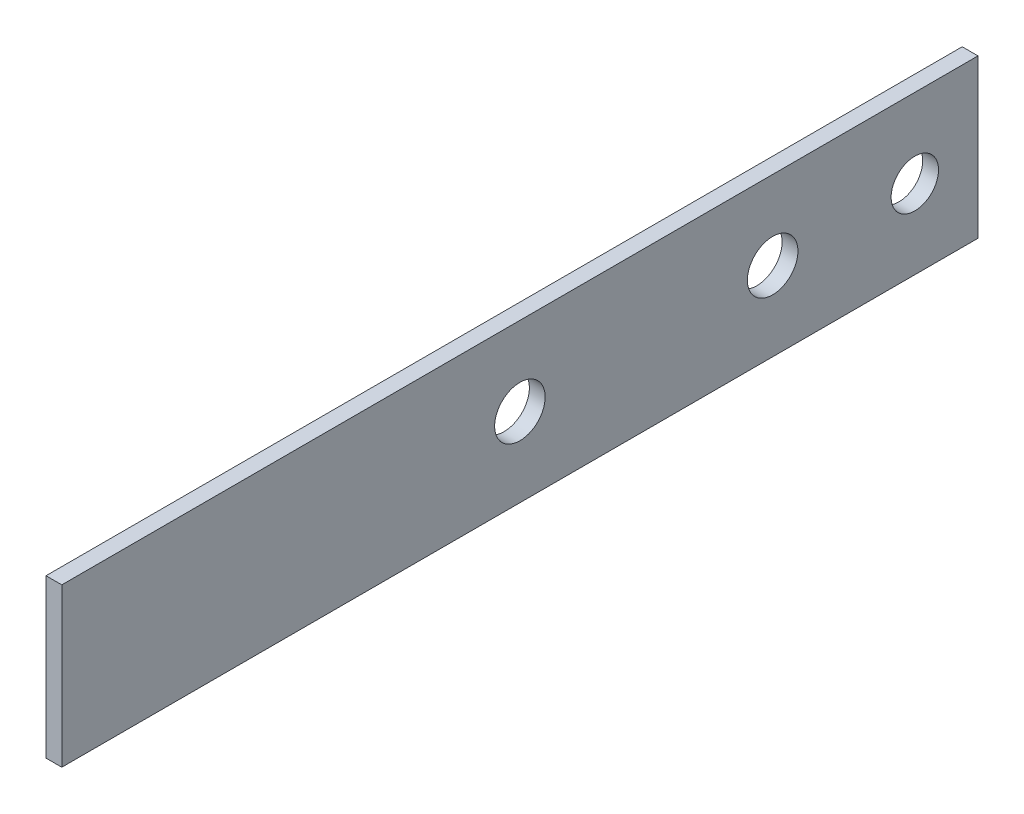
ISO-10303-21;
HEADER;
FILE_DESCRIPTION(('STEP AP214'),'2;1');
FILE_NAME('part.step','',(''),(''),'','','');
FILE_SCHEMA(('AUTOMOTIVE_DESIGN { 1 0 10303 214 1 1 1 1 }'));
ENDSEC;
DATA;
#1=APPLICATION_CONTEXT('core data for automotive mechanical design processes');
#2=APPLICATION_PROTOCOL_DEFINITION('international standard','automotive_design',2000,#1);
#3=PRODUCT_CONTEXT('',#1,'mechanical');
#4=PRODUCT('Part','Part','',(#3));
#5=PRODUCT_RELATED_PRODUCT_CATEGORY('part','',(#4));
#6=PRODUCT_DEFINITION_FORMATION('','',#4);
#7=PRODUCT_DEFINITION_CONTEXT('part definition',#1,'design');
#8=PRODUCT_DEFINITION('design','',#6,#7);
#9=PRODUCT_DEFINITION_SHAPE('','',#8);
#10=(LENGTH_UNIT() NAMED_UNIT(*) SI_UNIT(.MILLI.,.METRE.));
#11=(NAMED_UNIT(*) PLANE_ANGLE_UNIT() SI_UNIT($,.RADIAN.));
#12=(NAMED_UNIT(*) SI_UNIT($,.STERADIAN.) SOLID_ANGLE_UNIT());
#13=UNCERTAINTY_MEASURE_WITH_UNIT(LENGTH_MEASURE(1.E-05),#10,'distance_accuracy_value','');
#14=(GEOMETRIC_REPRESENTATION_CONTEXT(3) GLOBAL_UNCERTAINTY_ASSIGNED_CONTEXT((#13)) GLOBAL_UNIT_ASSIGNED_CONTEXT((#10,
#11,#12)) REPRESENTATION_CONTEXT('',''));
#15=CARTESIAN_POINT('',(0.,0.,0.));
#16=DIRECTION('',(0.,0.,1.));
#17=DIRECTION('',(1.,0.,0.));
#18=AXIS2_PLACEMENT_3D('',#15,#16,#17);
#19=CARTESIAN_POINT('',(1.,-5.,-29.));
#20=DIRECTION('',(0.,0.,1.));
#21=DIRECTION('',(1.,0.,0.));
#22=AXIS2_PLACEMENT_3D('',#19,#20,#21);
#23=PLANE('',#22);
#24=DIRECTION('',(0.,1.,0.));
#25=VECTOR('',#24,1.);
#26=CARTESIAN_POINT('',(0.,-5.,-29.));
#27=LINE('',#26,#25);
#28=CARTESIAN_POINT('',(0.,-5.,-29.));
#29=VERTEX_POINT('',#28);
#30=CARTESIAN_POINT('',(0.,5.,-29.));
#31=VERTEX_POINT('',#30);
#32=EDGE_CURVE('E118',#29,#31,#27,.T.);
#33=ORIENTED_EDGE('',*,*,#32,.T.);
#34=DIRECTION('',(-1.,0.,0.));
#35=VECTOR('',#34,1.);
#36=CARTESIAN_POINT('',(1.,5.,-29.));
#37=LINE('',#36,#35);
#38=CARTESIAN_POINT('',(1.,5.,-29.));
#39=VERTEX_POINT('',#38);
#40=EDGE_CURVE('E11',#39,#31,#37,.T.);
#41=ORIENTED_EDGE('',*,*,#40,.F.);
#42=DIRECTION('',(0.,1.,0.));
#43=VECTOR('',#42,1.);
#44=CARTESIAN_POINT('',(1.,-5.,-29.));
#45=LINE('',#44,#43);
#46=CARTESIAN_POINT('',(1.,-5.,-29.));
#47=VERTEX_POINT('',#46);
#48=EDGE_CURVE('E101',#47,#39,#45,.T.);
#49=ORIENTED_EDGE('',*,*,#48,.F.);
#50=DIRECTION('',(-1.,0.,0.));
#51=VECTOR('',#50,1.);
#52=CARTESIAN_POINT('',(1.,-5.,-29.));
#53=LINE('',#52,#51);
#54=EDGE_CURVE('E114',#47,#29,#53,.T.);
#55=ORIENTED_EDGE('',*,*,#54,.T.);
#56=EDGE_LOOP('',(#33,#41,#49,#55));
#57=FACE_BOUND('',#56,.T.);
#58=ADVANCED_FACE('F41',(#57),#23,.F.);
#59=CARTESIAN_POINT('',(1.,5.,29.));
#60=DIRECTION('',(0.,-1.,0.));
#61=DIRECTION('',(0.,0.,-1.));
#62=AXIS2_PLACEMENT_3D('',#59,#60,#61);
#63=PLANE('',#62);
#64=DIRECTION('',(0.,0.,1.));
#65=VECTOR('',#64,1.);
#66=CARTESIAN_POINT('',(0.,5.,29.));
#67=LINE('',#66,#65);
#68=CARTESIAN_POINT('',(0.,5.,29.));
#69=VERTEX_POINT('',#68);
#70=EDGE_CURVE('E106',#31,#69,#67,.T.);
#71=ORIENTED_EDGE('',*,*,#70,.T.);
#72=DIRECTION('',(-1.,0.,0.));
#73=VECTOR('',#72,1.);
#74=CARTESIAN_POINT('',(1.,5.,29.));
#75=LINE('',#74,#73);
#76=CARTESIAN_POINT('',(1.,5.,29.));
#77=VERTEX_POINT('',#76);
#78=EDGE_CURVE('E50',#77,#69,#75,.T.);
#79=ORIENTED_EDGE('',*,*,#78,.F.);
#80=DIRECTION('',(0.,0.,1.));
#81=VECTOR('',#80,1.);
#82=CARTESIAN_POINT('',(1.,5.,29.));
#83=LINE('',#82,#81);
#84=EDGE_CURVE('E96',#39,#77,#83,.T.);
#85=ORIENTED_EDGE('',*,*,#84,.F.);
#86=ORIENTED_EDGE('',*,*,#40,.T.);
#87=EDGE_LOOP('',(#71,#79,#85,#86));
#88=FACE_BOUND('',#87,.T.);
#89=ADVANCED_FACE('F105',(#88),#63,.F.);
#90=CARTESIAN_POINT('',(1.,-5.,29.));
#91=DIRECTION('',(0.,0.,-1.));
#92=DIRECTION('',(-1.,0.,0.));
#93=AXIS2_PLACEMENT_3D('',#90,#91,#92);
#94=PLANE('',#93);
#95=DIRECTION('',(0.,-1.,0.));
#96=VECTOR('',#95,1.);
#97=CARTESIAN_POINT('',(0.,-5.,29.));
#98=LINE('',#97,#96);
#99=CARTESIAN_POINT('',(0.,-5.,29.));
#100=VERTEX_POINT('',#99);
#101=EDGE_CURVE('E82',#69,#100,#98,.T.);
#102=ORIENTED_EDGE('',*,*,#101,.T.);
#103=DIRECTION('',(-1.,0.,0.));
#104=VECTOR('',#103,1.);
#105=CARTESIAN_POINT('',(1.,-5.,29.));
#106=LINE('',#105,#104);
#107=CARTESIAN_POINT('',(1.,-5.,29.));
#108=VERTEX_POINT('',#107);
#109=EDGE_CURVE('E108',#108,#100,#106,.T.);
#110=ORIENTED_EDGE('',*,*,#109,.F.);
#111=DIRECTION('',(0.,-1.,0.));
#112=VECTOR('',#111,1.);
#113=CARTESIAN_POINT('',(1.,-5.,29.));
#114=LINE('',#113,#112);
#115=EDGE_CURVE('E99',#77,#108,#114,.T.);
#116=ORIENTED_EDGE('',*,*,#115,.F.);
#117=ORIENTED_EDGE('',*,*,#78,.T.);
#118=EDGE_LOOP('',(#102,#110,#116,#117));
#119=FACE_BOUND('',#118,.T.);
#120=ADVANCED_FACE('F109',(#119),#94,.F.);
#121=CARTESIAN_POINT('',(1.,-5.,29.));
#122=DIRECTION('',(0.,1.,0.));
#123=DIRECTION('',(0.,0.,1.));
#124=AXIS2_PLACEMENT_3D('',#121,#122,#123);
#125=PLANE('',#124);
#126=DIRECTION('',(0.,0.,-1.));
#127=VECTOR('',#126,1.);
#128=CARTESIAN_POINT('',(0.,-5.,29.));
#129=LINE('',#128,#127);
#130=EDGE_CURVE('E88',#100,#29,#129,.T.);
#131=ORIENTED_EDGE('',*,*,#130,.T.);
#132=ORIENTED_EDGE('',*,*,#54,.F.);
#133=DIRECTION('',(0.,0.,-1.));
#134=VECTOR('',#133,1.);
#135=CARTESIAN_POINT('',(1.,-5.,29.));
#136=LINE('',#135,#134);
#137=EDGE_CURVE('E61',#108,#47,#136,.T.);
#138=ORIENTED_EDGE('',*,*,#137,.F.);
#139=ORIENTED_EDGE('',*,*,#109,.T.);
#140=EDGE_LOOP('',(#131,#132,#138,#139));
#141=FACE_BOUND('',#140,.T.);
#142=ADVANCED_FACE('F132',(#141),#125,.F.);
#143=CARTESIAN_POINT('',(1.,0.,0.));
#144=DIRECTION('',(-1.,0.,0.));
#145=DIRECTION('',(0.,0.,1.));
#146=AXIS2_PLACEMENT_3D('',#143,#144,#145);
#147=PLANE('',#146);
#148=CARTESIAN_POINT('',(1.,0.,-25.));
#149=DIRECTION('',(1.,0.,0.));
#150=DIRECTION('',(0.,0.,-1.));
#151=AXIS2_PLACEMENT_3D('',#148,#149,#150);
#152=CIRCLE('',#151,1.49999999999999);
#153=CARTESIAN_POINT('',(1.,0.,-26.5));
#154=VERTEX_POINT('',#153);
#155=EDGE_CURVE('E158',#154,#154,#152,.T.);
#156=ORIENTED_EDGE('',*,*,#155,.F.);
#157=EDGE_LOOP('',(#156));
#158=FACE_BOUND('',#157,.T.);
#159=CARTESIAN_POINT('',(1.,0.,-16.));
#160=DIRECTION('',(1.,0.,0.));
#161=DIRECTION('',(0.,0.,-1.));
#162=AXIS2_PLACEMENT_3D('',#159,#160,#161);
#163=CIRCLE('',#162,1.6);
#164=CARTESIAN_POINT('',(1.,0.,-17.6));
#165=VERTEX_POINT('',#164);
#166=EDGE_CURVE('E150',#165,#165,#163,.T.);
#167=ORIENTED_EDGE('',*,*,#166,.F.);
#168=EDGE_LOOP('',(#167));
#169=FACE_BOUND('',#168,.T.);
#170=CARTESIAN_POINT('',(1.,0.,0.));
#171=DIRECTION('',(1.,0.,0.));
#172=DIRECTION('',(0.,0.,-1.));
#173=AXIS2_PLACEMENT_3D('',#170,#171,#172);
#174=CIRCLE('',#173,1.6);
#175=CARTESIAN_POINT('',(1.,0.,-1.6));
#176=VERTEX_POINT('',#175);
#177=EDGE_CURVE('E143',#176,#176,#174,.T.);
#178=ORIENTED_EDGE('',*,*,#177,.F.);
#179=EDGE_LOOP('',(#178));
#180=FACE_BOUND('',#179,.T.);
#181=ORIENTED_EDGE('',*,*,#48,.T.);
#182=ORIENTED_EDGE('',*,*,#84,.T.);
#183=ORIENTED_EDGE('',*,*,#115,.T.);
#184=ORIENTED_EDGE('',*,*,#137,.T.);
#185=EDGE_LOOP('',(#181,#182,#183,#184));
#186=FACE_BOUND('',#185,.T.);
#187=ADVANCED_FACE('F97',(#158,#169,#180,#186),#147,.F.);
#188=CARTESIAN_POINT('',(0.,0.,0.));
#189=DIRECTION('',(-1.,0.,0.));
#190=DIRECTION('',(0.,0.,1.));
#191=AXIS2_PLACEMENT_3D('',#188,#189,#190);
#192=PLANE('',#191);
#193=CARTESIAN_POINT('',(0.,0.,-25.));
#194=DIRECTION('',(-1.,0.,0.));
#195=DIRECTION('',(0.,0.,1.));
#196=AXIS2_PLACEMENT_3D('',#193,#194,#195);
#197=CIRCLE('',#196,1.49999999999999);
#198=CARTESIAN_POINT('',(0.,0.,-23.5));
#199=VERTEX_POINT('',#198);
#200=EDGE_CURVE('E154',#199,#199,#197,.T.);
#201=ORIENTED_EDGE('',*,*,#200,.F.);
#202=EDGE_LOOP('',(#201));
#203=FACE_BOUND('',#202,.T.);
#204=CARTESIAN_POINT('',(0.,0.,-16.));
#205=DIRECTION('',(-1.,0.,0.));
#206=DIRECTION('',(0.,0.,1.));
#207=AXIS2_PLACEMENT_3D('',#204,#205,#206);
#208=CIRCLE('',#207,1.6);
#209=CARTESIAN_POINT('',(0.,0.,-14.4));
#210=VERTEX_POINT('',#209);
#211=EDGE_CURVE('E146',#210,#210,#208,.T.);
#212=ORIENTED_EDGE('',*,*,#211,.F.);
#213=EDGE_LOOP('',(#212));
#214=FACE_BOUND('',#213,.T.);
#215=CARTESIAN_POINT('',(0.,0.,0.));
#216=DIRECTION('',(-1.,0.,0.));
#217=DIRECTION('',(0.,0.,1.));
#218=AXIS2_PLACEMENT_3D('',#215,#216,#217);
#219=CIRCLE('',#218,1.6);
#220=CARTESIAN_POINT('',(0.,0.,1.6));
#221=VERTEX_POINT('',#220);
#222=EDGE_CURVE('E122',#221,#221,#219,.T.);
#223=ORIENTED_EDGE('',*,*,#222,.F.);
#224=EDGE_LOOP('',(#223));
#225=FACE_BOUND('',#224,.T.);
#226=ORIENTED_EDGE('',*,*,#32,.F.);
#227=ORIENTED_EDGE('',*,*,#130,.F.);
#228=ORIENTED_EDGE('',*,*,#101,.F.);
#229=ORIENTED_EDGE('',*,*,#70,.F.);
#230=EDGE_LOOP('',(#226,#227,#228,#229));
#231=FACE_BOUND('',#230,.T.);
#232=ADVANCED_FACE('F135',(#203,#214,#225,#231),#192,.T.);
#233=CARTESIAN_POINT('',(1.,0.,0.));
#234=DIRECTION('',(1.,0.,0.));
#235=DIRECTION('',(0.,0.,-1.));
#236=AXIS2_PLACEMENT_3D('',#233,#234,#235);
#237=CYLINDRICAL_SURFACE('',#236,1.6);
#238=ORIENTED_EDGE('',*,*,#177,.T.);
#239=EDGE_LOOP('',(#238));
#240=FACE_BOUND('',#239,.T.);
#241=ORIENTED_EDGE('',*,*,#222,.T.);
#242=EDGE_LOOP('',(#241));
#243=FACE_BOUND('',#242,.T.);
#244=ADVANCED_FACE('F172',(#240,#243),#237,.F.);
#245=CARTESIAN_POINT('',(1.,0.,-16.));
#246=DIRECTION('',(1.,0.,0.));
#247=DIRECTION('',(0.,0.,-1.));
#248=AXIS2_PLACEMENT_3D('',#245,#246,#247);
#249=CYLINDRICAL_SURFACE('',#248,1.6);
#250=ORIENTED_EDGE('',*,*,#166,.T.);
#251=EDGE_LOOP('',(#250));
#252=FACE_BOUND('',#251,.T.);
#253=ORIENTED_EDGE('',*,*,#211,.T.);
#254=EDGE_LOOP('',(#253));
#255=FACE_BOUND('',#254,.T.);
#256=ADVANCED_FACE('F175',(#252,#255),#249,.F.);
#257=CARTESIAN_POINT('',(1.,0.,-25.));
#258=DIRECTION('',(1.,0.,0.));
#259=DIRECTION('',(0.,0.,-1.));
#260=AXIS2_PLACEMENT_3D('',#257,#258,#259);
#261=CYLINDRICAL_SURFACE('',#260,1.49999999999999);
#262=ORIENTED_EDGE('',*,*,#155,.T.);
#263=EDGE_LOOP('',(#262));
#264=FACE_BOUND('',#263,.T.);
#265=ORIENTED_EDGE('',*,*,#200,.T.);
#266=EDGE_LOOP('',(#265));
#267=FACE_BOUND('',#266,.T.);
#268=ADVANCED_FACE('F162',(#264,#267),#261,.F.);
#269=CLOSED_SHELL('',(#58,#89,#120,#142,#187,#232,#244,#256,#268));
#270=MANIFOLD_SOLID_BREP('B2',#269);
#271=ADVANCED_BREP_SHAPE_REPRESENTATION('',(#18,#270),#14);
#272=SHAPE_DEFINITION_REPRESENTATION(#9,#271);
ENDSEC;
END-ISO-10303-21;
